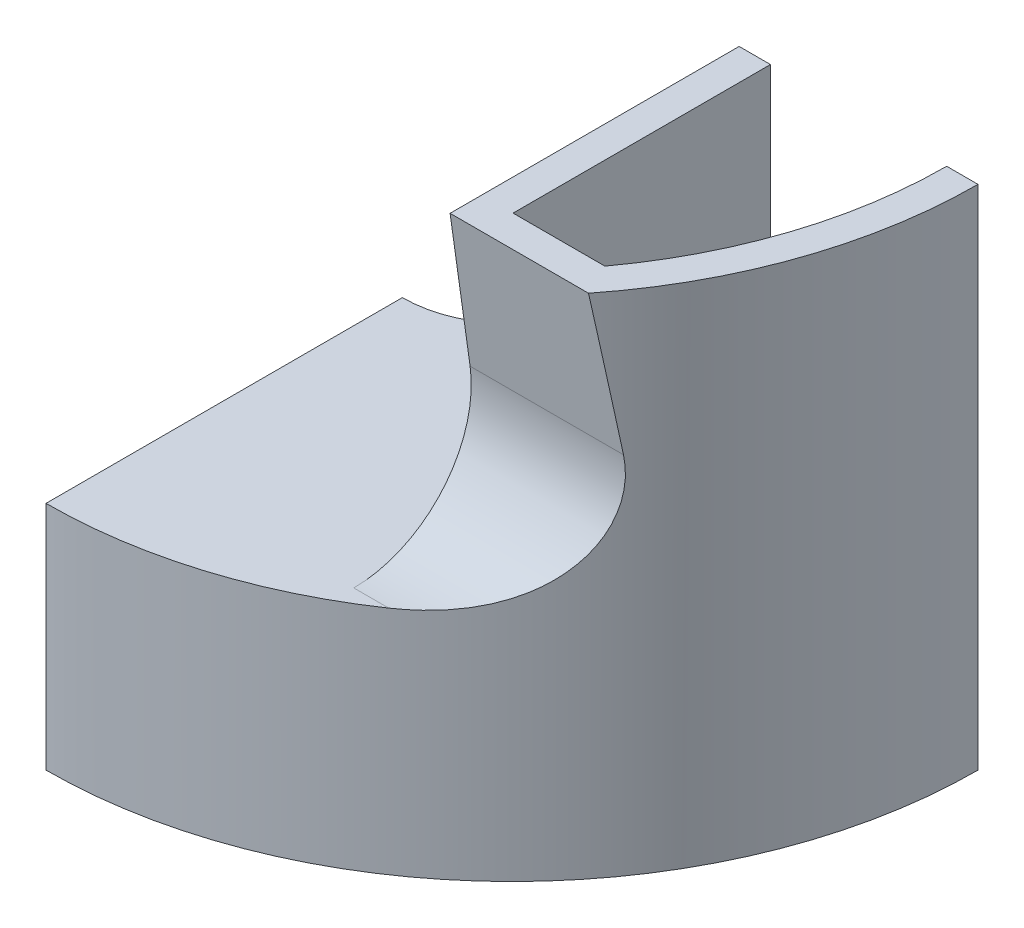
ISO-10303-21;
HEADER;
FILE_DESCRIPTION(('STEP AP214'),'2;1');
FILE_NAME('part.step','',(''),(''),'','','');
FILE_SCHEMA(('AUTOMOTIVE_DESIGN { 1 0 10303 214 1 1 1 1 }'));
ENDSEC;
DATA;
#1=APPLICATION_CONTEXT('core data for automotive mechanical design processes');
#2=APPLICATION_PROTOCOL_DEFINITION('international standard','automotive_design',2000,#1);
#3=PRODUCT_CONTEXT('',#1,'mechanical');
#4=PRODUCT('Part','Part','',(#3));
#5=PRODUCT_RELATED_PRODUCT_CATEGORY('part','',(#4));
#6=PRODUCT_DEFINITION_FORMATION('','',#4);
#7=PRODUCT_DEFINITION_CONTEXT('part definition',#1,'design');
#8=PRODUCT_DEFINITION('design','',#6,#7);
#9=PRODUCT_DEFINITION_SHAPE('','',#8);
#10=(LENGTH_UNIT() NAMED_UNIT(*) SI_UNIT(.MILLI.,.METRE.));
#11=(NAMED_UNIT(*) PLANE_ANGLE_UNIT() SI_UNIT($,.RADIAN.));
#12=(NAMED_UNIT(*) SI_UNIT($,.STERADIAN.) SOLID_ANGLE_UNIT());
#13=UNCERTAINTY_MEASURE_WITH_UNIT(LENGTH_MEASURE(1.E-05),#10,'distance_accuracy_value','');
#14=(GEOMETRIC_REPRESENTATION_CONTEXT(3) GLOBAL_UNCERTAINTY_ASSIGNED_CONTEXT((#13)) GLOBAL_UNIT_ASSIGNED_CONTEXT((#10,
#11,#12)) REPRESENTATION_CONTEXT('',''));
#15=CARTESIAN_POINT('',(0.,0.,0.));
#16=DIRECTION('',(0.,0.,1.));
#17=DIRECTION('',(1.,0.,0.));
#18=AXIS2_PLACEMENT_3D('',#15,#16,#17);
#19=CARTESIAN_POINT('',(0.,129.55,0.));
#20=DIRECTION('',(0.,-1.,0.));
#21=DIRECTION('',(0.,0.,-1.));
#22=AXIS2_PLACEMENT_3D('',#19,#20,#21);
#23=PLANE('',#22);
#24=DIRECTION('',(0.,0.,-1.));
#25=VECTOR('',#24,1.);
#26=CARTESIAN_POINT('',(66.,129.55,0.));
#27=LINE('',#26,#25);
#28=CARTESIAN_POINT('',(66.,129.55,65.7296962395799));
#29=VERTEX_POINT('',#28);
#30=CARTESIAN_POINT('',(66.,129.55,0.));
#31=VERTEX_POINT('',#30);
#32=EDGE_CURVE('E45',#29,#31,#27,.T.);
#33=ORIENTED_EDGE('',*,*,#32,.T.);
#34=DIRECTION('',(1.,0.,0.));
#35=VECTOR('',#34,1.);
#36=CARTESIAN_POINT('',(0.,129.55,0.));
#37=LINE('',#36,#35);
#38=CARTESIAN_POINT('',(58.,129.55,0.));
#39=VERTEX_POINT('',#38);
#40=EDGE_CURVE('E299',#39,#31,#37,.T.);
#41=ORIENTED_EDGE('',*,*,#40,.F.);
#42=DIRECTION('',(0.,0.,-1.));
#43=VECTOR('',#42,1.);
#44=CARTESIAN_POINT('',(58.,129.55,0.));
#45=LINE('',#44,#43);
#46=CARTESIAN_POINT('',(58.,129.55,73.8083168197288));
#47=VERTEX_POINT('',#46);
#48=EDGE_CURVE('E294',#47,#39,#45,.T.);
#49=ORIENTED_EDGE('',*,*,#48,.F.);
#50=DIRECTION('',(-1.,0.,0.));
#51=VECTOR('',#50,1.);
#52=CARTESIAN_POINT('',(119.001,129.55,73.8083168197288));
#53=LINE('',#52,#51);
#54=CARTESIAN_POINT('',(93.3452321666111,129.55,73.8083168197288));
#55=VERTEX_POINT('',#54);
#56=EDGE_CURVE('E296',#55,#47,#53,.T.);
#57=ORIENTED_EDGE('',*,*,#56,.F.);
#58=CARTESIAN_POINT('',(0.,129.55,0.));
#59=DIRECTION('',(0.,-1.,0.));
#60=DIRECTION('',(0.,0.,-1.));
#61=AXIS2_PLACEMENT_3D('',#58,#59,#60);
#62=CIRCLE('',#61,119.);
#63=CARTESIAN_POINT('',(119.,129.55,0.));
#64=VERTEX_POINT('',#63);
#65=EDGE_CURVE('E292',#64,#55,#62,.T.);
#66=ORIENTED_EDGE('',*,*,#65,.F.);
#67=CARTESIAN_POINT('',(111.,129.55,0.));
#68=VERTEX_POINT('',#67);
#69=EDGE_CURVE('E298',#68,#64,#37,.T.);
#70=ORIENTED_EDGE('',*,*,#69,.F.);
#71=CARTESIAN_POINT('',(0.,129.55,0.));
#72=DIRECTION('',(0.,-1.,0.));
#73=DIRECTION('',(0.,0.,-1.));
#74=AXIS2_PLACEMENT_3D('',#71,#72,#73);
#75=CIRCLE('',#74,111.);
#76=CARTESIAN_POINT('',(89.4461124490749,129.55,65.7296962395799));
#77=VERTEX_POINT('',#76);
#78=EDGE_CURVE('E301',#68,#77,#75,.T.);
#79=ORIENTED_EDGE('',*,*,#78,.T.);
#80=DIRECTION('',(-1.,0.,0.));
#81=VECTOR('',#80,1.);
#82=CARTESIAN_POINT('',(119.001,129.55,65.7296962395799));
#83=LINE('',#82,#81);
#84=EDGE_CURVE('E11',#77,#29,#83,.T.);
#85=ORIENTED_EDGE('',*,*,#84,.T.);
#86=EDGE_LOOP('',(#33,#41,#49,#57,#66,#70,#79,#85));
#87=FACE_BOUND('',#86,.T.);
#88=ADVANCED_FACE('F42',(#87),#23,.F.);
#89=CARTESIAN_POINT('',(15.5563491861041,12.9,15.556349186104));
#90=DIRECTION('',(0.,1.,0.));
#91=DIRECTION('',(0.,0.,-1.));
#92=AXIS2_PLACEMENT_3D('',#89,#90,#91);
#93=PLANE('',#92);
#94=CARTESIAN_POINT('',(15.5563491861041,12.9,15.556349186104));
#95=DIRECTION('',(0.,1.,0.));
#96=DIRECTION('',(0.,0.,-1.));
#97=AXIS2_PLACEMENT_3D('',#94,#95,#96);
#98=CIRCLE('',#97,2.1);
#99=CARTESIAN_POINT('',(15.5563491861041,12.9,13.456349186104));
#100=VERTEX_POINT('',#99);
#101=EDGE_CURVE('E341',#100,#100,#98,.T.);
#102=ORIENTED_EDGE('',*,*,#101,.T.);
#103=EDGE_LOOP('',(#102));
#104=FACE_BOUND('',#103,.T.);
#105=ADVANCED_FACE('F442',(#104),#93,.T.);
#106=CARTESIAN_POINT('',(15.5563491861041,12.9,15.556349186104));
#107=DIRECTION('',(0.,1.,0.));
#108=DIRECTION('',(0.,0.,1.));
#109=AXIS2_PLACEMENT_3D('',#106,#107,#108);
#110=CYLINDRICAL_SURFACE('',#109,2.1);
#111=ORIENTED_EDGE('',*,*,#101,.F.);
#112=EDGE_LOOP('',(#111));
#113=FACE_BOUND('',#112,.T.);
#114=CARTESIAN_POINT('',(15.5563491861041,22.9,15.556349186104));
#115=DIRECTION('',(0.,1.,0.));
#116=DIRECTION('',(0.,0.,-1.));
#117=AXIS2_PLACEMENT_3D('',#114,#115,#116);
#118=CIRCLE('',#117,2.1);
#119=CARTESIAN_POINT('',(15.5563491861041,22.9,13.456349186104));
#120=VERTEX_POINT('',#119);
#121=EDGE_CURVE('E289',#120,#120,#118,.T.);
#122=ORIENTED_EDGE('',*,*,#121,.T.);
#123=EDGE_LOOP('',(#122));
#124=FACE_BOUND('',#123,.T.);
#125=ADVANCED_FACE('F444',(#113,#124),#110,.F.);
#126=CARTESIAN_POINT('',(0.,22.9,0.));
#127=DIRECTION('',(0.,1.,0.));
#128=DIRECTION('',(0.,0.,1.));
#129=AXIS2_PLACEMENT_3D('',#126,#127,#128);
#130=CYLINDRICAL_SURFACE('',#129,28.);
#131=CARTESIAN_POINT('',(0.,22.9,0.));
#132=DIRECTION('',(0.,1.,0.));
#133=DIRECTION('',(0.,0.,1.));
#134=AXIS2_PLACEMENT_3D('',#131,#132,#133);
#135=CIRCLE('',#134,28.);
#136=CARTESIAN_POINT('',(0.,22.9,28.));
#137=VERTEX_POINT('',#136);
#138=CARTESIAN_POINT('',(28.,22.9,0.));
#139=VERTEX_POINT('',#138);
#140=EDGE_CURVE('E335',#137,#139,#135,.T.);
#141=ORIENTED_EDGE('',*,*,#140,.F.);
#142=DIRECTION('',(0.,1.,0.));
#143=VECTOR('',#142,1.);
#144=CARTESIAN_POINT('',(0.,22.9,28.));
#145=LINE('',#144,#143);
#146=CARTESIAN_POINT('',(0.,59.,28.));
#147=VERTEX_POINT('',#146);
#148=EDGE_CURVE('E273',#137,#147,#145,.T.);
#149=ORIENTED_EDGE('',*,*,#148,.T.);
#150=CARTESIAN_POINT('',(0.,59.,0.));
#151=DIRECTION('',(0.,1.,0.));
#152=DIRECTION('',(0.,0.,1.));
#153=AXIS2_PLACEMENT_3D('',#150,#151,#152);
#154=CIRCLE('',#153,28.);
#155=CARTESIAN_POINT('',(28.,59.,0.));
#156=VERTEX_POINT('',#155);
#157=EDGE_CURVE('E338',#147,#156,#154,.T.);
#158=ORIENTED_EDGE('',*,*,#157,.T.);
#159=DIRECTION('',(0.,1.,0.));
#160=VECTOR('',#159,1.);
#161=CARTESIAN_POINT('',(28.,22.9,0.));
#162=LINE('',#161,#160);
#163=EDGE_CURVE('E274',#156,#139,#162,.F.);
#164=ORIENTED_EDGE('',*,*,#163,.T.);
#165=EDGE_LOOP('',(#141,#149,#158,#164));
#166=FACE_BOUND('',#165,.T.);
#167=ADVANCED_FACE('F391',(#166),#130,.F.);
#168=CARTESIAN_POINT('',(0.,22.9,0.));
#169=DIRECTION('',(0.,1.,0.));
#170=DIRECTION('',(0.,0.,1.));
#171=AXIS2_PLACEMENT_3D('',#168,#169,#170);
#172=PLANE('',#171);
#173=DIRECTION('',(0.,0.,-1.));
#174=VECTOR('',#173,1.);
#175=CARTESIAN_POINT('',(0.,22.9,0.));
#176=LINE('',#175,#174);
#177=CARTESIAN_POINT('',(0.,22.9,12.5));
#178=VERTEX_POINT('',#177);
#179=EDGE_CURVE('E260',#137,#178,#176,.T.);
#180=ORIENTED_EDGE('',*,*,#179,.F.);
#181=ORIENTED_EDGE('',*,*,#140,.T.);
#182=DIRECTION('',(1.,0.,0.));
#183=VECTOR('',#182,1.);
#184=CARTESIAN_POINT('',(0.,22.9,0.));
#185=LINE('',#184,#183);
#186=CARTESIAN_POINT('',(12.5,22.9,0.));
#187=VERTEX_POINT('',#186);
#188=EDGE_CURVE('E257',#187,#139,#185,.T.);
#189=ORIENTED_EDGE('',*,*,#188,.F.);
#190=CARTESIAN_POINT('',(0.,22.9,0.));
#191=DIRECTION('',(0.,1.,0.));
#192=DIRECTION('',(0.,0.,1.));
#193=AXIS2_PLACEMENT_3D('',#190,#191,#192);
#194=CIRCLE('',#193,12.5);
#195=EDGE_CURVE('E332',#187,#178,#194,.F.);
#196=ORIENTED_EDGE('',*,*,#195,.T.);
#197=EDGE_LOOP('',(#180,#181,#189,#196));
#198=FACE_BOUND('',#197,.T.);
#199=ORIENTED_EDGE('',*,*,#121,.F.);
#200=EDGE_LOOP('',(#199));
#201=FACE_BOUND('',#200,.T.);
#202=ADVANCED_FACE('F452',(#198,#201),#172,.T.);
#203=CARTESIAN_POINT('',(0.,259.1,0.));
#204=DIRECTION('',(0.,-1.,0.));
#205=DIRECTION('',(0.,0.,-1.));
#206=AXIS2_PLACEMENT_3D('',#203,#204,#205);
#207=CYLINDRICAL_SURFACE('',#206,12.5);
#208=CARTESIAN_POINT('',(0.,7.00000000000001,0.));
#209=DIRECTION('',(0.,-1.,0.));
#210=DIRECTION('',(0.,0.,-1.));
#211=AXIS2_PLACEMENT_3D('',#208,#209,#210);
#212=CIRCLE('',#211,12.5);
#213=CARTESIAN_POINT('',(0.,7.00000000000001,12.5));
#214=VERTEX_POINT('',#213);
#215=CARTESIAN_POINT('',(12.5,7.00000000000001,0.));
#216=VERTEX_POINT('',#215);
#217=EDGE_CURVE('E287',#214,#216,#212,.F.);
#218=ORIENTED_EDGE('',*,*,#217,.F.);
#219=DIRECTION('',(0.,-1.,0.));
#220=VECTOR('',#219,1.);
#221=CARTESIAN_POINT('',(0.,259.1,12.5));
#222=LINE('',#221,#220);
#223=EDGE_CURVE('E268',#214,#178,#222,.F.);
#224=ORIENTED_EDGE('',*,*,#223,.T.);
#225=ORIENTED_EDGE('',*,*,#195,.F.);
#226=DIRECTION('',(0.,-1.,0.));
#227=VECTOR('',#226,1.);
#228=CARTESIAN_POINT('',(12.5,259.1,0.));
#229=LINE('',#228,#227);
#230=EDGE_CURVE('E269',#187,#216,#229,.T.);
#231=ORIENTED_EDGE('',*,*,#230,.T.);
#232=EDGE_LOOP('',(#218,#224,#225,#231));
#233=FACE_BOUND('',#232,.T.);
#234=ADVANCED_FACE('F564',(#233),#207,.F.);
#235=CARTESIAN_POINT('',(0.,7.,0.));
#236=DIRECTION('',(0.,-1.,0.));
#237=DIRECTION('',(0.,0.,-1.));
#238=AXIS2_PLACEMENT_3D('',#235,#236,#237);
#239=PLANE('',#238);
#240=DIRECTION('',(0.,0.,1.));
#241=VECTOR('',#240,1.);
#242=CARTESIAN_POINT('',(0.,7.,0.));
#243=LINE('',#242,#241);
#244=CARTESIAN_POINT('',(0.,7.,65.));
#245=VERTEX_POINT('',#244);
#246=EDGE_CURVE('E256',#214,#245,#243,.T.);
#247=ORIENTED_EDGE('',*,*,#246,.F.);
#248=ORIENTED_EDGE('',*,*,#217,.T.);
#249=DIRECTION('',(-1.,0.,0.));
#250=VECTOR('',#249,1.);
#251=CARTESIAN_POINT('',(0.,7.,0.));
#252=LINE('',#251,#250);
#253=CARTESIAN_POINT('',(65.,7.,0.));
#254=VERTEX_POINT('',#253);
#255=EDGE_CURVE('E253',#254,#216,#252,.T.);
#256=ORIENTED_EDGE('',*,*,#255,.F.);
#257=CARTESIAN_POINT('',(0.,7.,0.));
#258=DIRECTION('',(0.,-1.,0.));
#259=DIRECTION('',(0.,0.,-1.));
#260=AXIS2_PLACEMENT_3D('',#257,#258,#259);
#261=CIRCLE('',#260,65.);
#262=EDGE_CURVE('E290',#254,#245,#261,.T.);
#263=ORIENTED_EDGE('',*,*,#262,.T.);
#264=EDGE_LOOP('',(#247,#248,#256,#263));
#265=FACE_BOUND('',#264,.T.);
#266=ADVANCED_FACE('F575',(#265),#239,.T.);
#267=CARTESIAN_POINT('',(0.,7.,0.));
#268=DIRECTION('',(0.,-1.,0.));
#269=DIRECTION('',(0.,0.,-1.));
#270=AXIS2_PLACEMENT_3D('',#267,#268,#269);
#271=CYLINDRICAL_SURFACE('',#270,65.);
#272=CARTESIAN_POINT('',(0.,0.,0.));
#273=DIRECTION('',(0.,-1.,0.));
#274=DIRECTION('',(0.,0.,-1.));
#275=AXIS2_PLACEMENT_3D('',#272,#273,#274);
#276=CIRCLE('',#275,65.);
#277=CARTESIAN_POINT('',(65.,0.,0.));
#278=VERTEX_POINT('',#277);
#279=CARTESIAN_POINT('',(0.,0.,65.));
#280=VERTEX_POINT('',#279);
#281=EDGE_CURVE('E218',#278,#280,#276,.T.);
#282=ORIENTED_EDGE('',*,*,#281,.T.);
#283=DIRECTION('',(0.,-1.,0.));
#284=VECTOR('',#283,1.);
#285=CARTESIAN_POINT('',(0.,7.,65.));
#286=LINE('',#285,#284);
#287=EDGE_CURVE('E276',#280,#245,#286,.F.);
#288=ORIENTED_EDGE('',*,*,#287,.T.);
#289=ORIENTED_EDGE('',*,*,#262,.F.);
#290=DIRECTION('',(0.,-1.,0.));
#291=VECTOR('',#290,1.);
#292=CARTESIAN_POINT('',(65.,7.,0.));
#293=LINE('',#292,#291);
#294=EDGE_CURVE('E277',#254,#278,#293,.T.);
#295=ORIENTED_EDGE('',*,*,#294,.T.);
#296=EDGE_LOOP('',(#282,#288,#289,#295));
#297=FACE_BOUND('',#296,.T.);
#298=ADVANCED_FACE('F346',(#297),#271,.F.);
#299=CARTESIAN_POINT('',(0.,7.,0.));
#300=DIRECTION('',(0.,-1.,0.));
#301=DIRECTION('',(0.,0.,-1.));
#302=AXIS2_PLACEMENT_3D('',#299,#300,#301);
#303=CYLINDRICAL_SURFACE('',#302,73.);
#304=DIRECTION('',(0.,-1.,0.));
#305=VECTOR('',#304,1.);
#306=CARTESIAN_POINT('',(0.,7.,73.));
#307=LINE('',#306,#305);
#308=CARTESIAN_POINT('',(0.,8.,73.));
#309=VERTEX_POINT('',#308);
#310=CARTESIAN_POINT('',(0.,15.,73.));
#311=VERTEX_POINT('',#310);
#312=EDGE_CURVE('E198',#309,#311,#307,.F.);
#313=ORIENTED_EDGE('',*,*,#312,.F.);
#314=CARTESIAN_POINT('',(0.,8.,0.));
#315=DIRECTION('',(0.,1.,0.));
#316=DIRECTION('',(0.,0.,1.));
#317=AXIS2_PLACEMENT_3D('',#314,#315,#316);
#318=CIRCLE('',#317,73.);
#319=CARTESIAN_POINT('',(73.,8.,0.));
#320=VERTEX_POINT('',#319);
#321=EDGE_CURVE('E195',#320,#309,#318,.F.);
#322=ORIENTED_EDGE('',*,*,#321,.F.);
#323=DIRECTION('',(0.,-1.,0.));
#324=VECTOR('',#323,1.);
#325=CARTESIAN_POINT('',(73.,7.,0.));
#326=LINE('',#325,#324);
#327=CARTESIAN_POINT('',(73.,15.,0.));
#328=VERTEX_POINT('',#327);
#329=EDGE_CURVE('E189',#328,#320,#326,.T.);
#330=ORIENTED_EDGE('',*,*,#329,.F.);
#331=CARTESIAN_POINT('',(0.,15.,0.));
#332=DIRECTION('',(0.,-1.,0.));
#333=DIRECTION('',(0.,0.,-1.));
#334=AXIS2_PLACEMENT_3D('',#331,#332,#333);
#335=CIRCLE('',#334,73.);
#336=EDGE_CURVE('E193',#328,#311,#335,.T.);
#337=ORIENTED_EDGE('',*,*,#336,.T.);
#338=EDGE_LOOP('',(#313,#322,#330,#337));
#339=FACE_BOUND('',#338,.T.);
#340=ADVANCED_FACE('F191',(#339),#303,.T.);
#341=CARTESIAN_POINT('',(0.,15.,0.));
#342=DIRECTION('',(0.,-1.,0.));
#343=DIRECTION('',(0.,0.,-1.));
#344=AXIS2_PLACEMENT_3D('',#341,#342,#343);
#345=PLANE('',#344);
#346=CARTESIAN_POINT('',(0.,15.,0.));
#347=DIRECTION('',(0.,-1.,0.));
#348=DIRECTION('',(0.,0.,-1.));
#349=AXIS2_PLACEMENT_3D('',#346,#347,#348);
#350=CIRCLE('',#349,36.);
#351=CARTESIAN_POINT('',(0.,15.,36.));
#352=VERTEX_POINT('',#351);
#353=CARTESIAN_POINT('',(36.,15.,0.));
#354=VERTEX_POINT('',#353);
#355=EDGE_CURVE('E215',#352,#354,#350,.F.);
#356=ORIENTED_EDGE('',*,*,#355,.F.);
#357=DIRECTION('',(0.,0.,1.));
#358=VECTOR('',#357,1.);
#359=CARTESIAN_POINT('',(0.,15.,0.));
#360=LINE('',#359,#358);
#361=EDGE_CURVE('E210',#352,#311,#360,.T.);
#362=ORIENTED_EDGE('',*,*,#361,.T.);
#363=ORIENTED_EDGE('',*,*,#336,.F.);
#364=DIRECTION('',(-1.,0.,0.));
#365=VECTOR('',#364,1.);
#366=CARTESIAN_POINT('',(0.,15.,0.));
#367=LINE('',#366,#365);
#368=EDGE_CURVE('E201',#328,#354,#367,.T.);
#369=ORIENTED_EDGE('',*,*,#368,.T.);
#370=EDGE_LOOP('',(#356,#362,#363,#369));
#371=FACE_BOUND('',#370,.T.);
#372=ADVANCED_FACE('F212',(#371),#345,.F.);
#373=CARTESIAN_POINT('',(0.,22.9,0.));
#374=DIRECTION('',(0.,1.,0.));
#375=DIRECTION('',(0.,0.,1.));
#376=AXIS2_PLACEMENT_3D('',#373,#374,#375);
#377=CYLINDRICAL_SURFACE('',#376,36.);
#378=DIRECTION('',(0.,1.,0.));
#379=VECTOR('',#378,1.);
#380=CARTESIAN_POINT('',(0.,22.9,36.));
#381=LINE('',#380,#379);
#382=CARTESIAN_POINT('',(0.,51.,36.));
#383=VERTEX_POINT('',#382);
#384=EDGE_CURVE('E239',#352,#383,#381,.T.);
#385=ORIENTED_EDGE('',*,*,#384,.F.);
#386=ORIENTED_EDGE('',*,*,#355,.T.);
#387=DIRECTION('',(0.,1.,0.));
#388=VECTOR('',#387,1.);
#389=CARTESIAN_POINT('',(36.,22.9,0.));
#390=LINE('',#389,#388);
#391=CARTESIAN_POINT('',(36.,51.,0.));
#392=VERTEX_POINT('',#391);
#393=EDGE_CURVE('E205',#392,#354,#390,.F.);
#394=ORIENTED_EDGE('',*,*,#393,.F.);
#395=CARTESIAN_POINT('',(0.,51.,0.));
#396=DIRECTION('',(0.,1.,0.));
#397=DIRECTION('',(0.,0.,1.));
#398=AXIS2_PLACEMENT_3D('',#395,#396,#397);
#399=CIRCLE('',#398,36.);
#400=EDGE_CURVE('E232',#383,#392,#399,.T.);
#401=ORIENTED_EDGE('',*,*,#400,.F.);
#402=EDGE_LOOP('',(#385,#386,#394,#401));
#403=FACE_BOUND('',#402,.T.);
#404=ADVANCED_FACE('F320',(#403),#377,.T.);
#405=CARTESIAN_POINT('',(0.,8.,0.));
#406=DIRECTION('',(0.,1.,0.));
#407=DIRECTION('',(0.,0.,1.));
#408=AXIS2_PLACEMENT_3D('',#405,#406,#407);
#409=PLANE('',#408);
#410=DIRECTION('',(0.,0.,-1.));
#411=VECTOR('',#410,1.);
#412=CARTESIAN_POINT('',(0.,8.,0.));
#413=LINE('',#412,#411);
#414=CARTESIAN_POINT('',(0.,8.,111.));
#415=VERTEX_POINT('',#414);
#416=EDGE_CURVE('E242',#415,#309,#413,.T.);
#417=ORIENTED_EDGE('',*,*,#416,.F.);
#418=CARTESIAN_POINT('',(0.,8.,0.));
#419=DIRECTION('',(0.,1.,0.));
#420=DIRECTION('',(0.,0.,1.));
#421=AXIS2_PLACEMENT_3D('',#418,#419,#420);
#422=CIRCLE('',#421,111.);
#423=CARTESIAN_POINT('',(111.,8.,0.));
#424=VERTEX_POINT('',#423);
#425=EDGE_CURVE('E228',#415,#424,#422,.T.);
#426=ORIENTED_EDGE('',*,*,#425,.T.);
#427=DIRECTION('',(1.,0.,0.));
#428=VECTOR('',#427,1.);
#429=CARTESIAN_POINT('',(0.,8.,0.));
#430=LINE('',#429,#428);
#431=EDGE_CURVE('E240',#320,#424,#430,.T.);
#432=ORIENTED_EDGE('',*,*,#431,.F.);
#433=ORIENTED_EDGE('',*,*,#321,.T.);
#434=EDGE_LOOP('',(#417,#426,#432,#433));
#435=FACE_BOUND('',#434,.T.);
#436=ADVANCED_FACE('F375',(#435),#409,.T.);
#437=CARTESIAN_POINT('',(0.,0.,0.));
#438=DIRECTION('',(0.,1.,0.));
#439=DIRECTION('',(0.,0.,1.));
#440=AXIS2_PLACEMENT_3D('',#437,#438,#439);
#441=PLANE('',#440);
#442=CARTESIAN_POINT('',(0.,0.,0.));
#443=DIRECTION('',(0.,1.,0.));
#444=DIRECTION('',(0.,0.,1.));
#445=AXIS2_PLACEMENT_3D('',#442,#443,#444);
#446=CIRCLE('',#445,119.);
#447=CARTESIAN_POINT('',(0.,0.,119.));
#448=VERTEX_POINT('',#447);
#449=CARTESIAN_POINT('',(119.,0.,0.));
#450=VERTEX_POINT('',#449);
#451=EDGE_CURVE('E214',#448,#450,#446,.T.);
#452=ORIENTED_EDGE('',*,*,#451,.F.);
#453=DIRECTION('',(0.,0.,-1.));
#454=VECTOR('',#453,1.);
#455=CARTESIAN_POINT('',(0.,0.,0.));
#456=LINE('',#455,#454);
#457=EDGE_CURVE('E264',#448,#280,#456,.T.);
#458=ORIENTED_EDGE('',*,*,#457,.T.);
#459=ORIENTED_EDGE('',*,*,#281,.F.);
#460=DIRECTION('',(1.,0.,0.));
#461=VECTOR('',#460,1.);
#462=CARTESIAN_POINT('',(0.,0.,0.));
#463=LINE('',#462,#461);
#464=EDGE_CURVE('E266',#278,#450,#463,.T.);
#465=ORIENTED_EDGE('',*,*,#464,.T.);
#466=EDGE_LOOP('',(#452,#458,#459,#465));
#467=FACE_BOUND('',#466,.T.);
#468=ADVANCED_FACE('F354',(#467),#441,.F.);
#469=CARTESIAN_POINT('',(0.,0.,0.));
#470=DIRECTION('',(1.,0.,0.));
#471=DIRECTION('',(0.,0.,-1.));
#472=AXIS2_PLACEMENT_3D('',#469,#470,#471);
#473=PLANE('',#472);
#474=ORIENTED_EDGE('',*,*,#384,.T.);
#475=DIRECTION('',(0.,0.,-1.));
#476=VECTOR('',#475,1.);
#477=CARTESIAN_POINT('',(0.,51.,0.));
#478=LINE('',#477,#476);
#479=CARTESIAN_POINT('',(0.,51.,111.));
#480=VERTEX_POINT('',#479);
#481=EDGE_CURVE('E209',#480,#383,#478,.T.);
#482=ORIENTED_EDGE('',*,*,#481,.F.);
#483=DIRECTION('',(0.,-1.,0.));
#484=VECTOR('',#483,1.);
#485=CARTESIAN_POINT('',(0.,59.,111.));
#486=LINE('',#485,#484);
#487=EDGE_CURVE('E248',#480,#415,#486,.T.);
#488=ORIENTED_EDGE('',*,*,#487,.T.);
#489=ORIENTED_EDGE('',*,*,#416,.T.);
#490=ORIENTED_EDGE('',*,*,#312,.T.);
#491=ORIENTED_EDGE('',*,*,#361,.F.);
#492=EDGE_LOOP('',(#474,#482,#488,#489,#490,#491));
#493=FACE_BOUND('',#492,.T.);
#494=ORIENTED_EDGE('',*,*,#457,.F.);
#495=DIRECTION('',(0.,-1.,0.));
#496=VECTOR('',#495,1.);
#497=CARTESIAN_POINT('',(0.,59.,119.));
#498=LINE('',#497,#496);
#499=CARTESIAN_POINT('',(0.,59.,119.));
#500=VERTEX_POINT('',#499);
#501=EDGE_CURVE('E265',#500,#448,#498,.T.);
#502=ORIENTED_EDGE('',*,*,#501,.F.);
#503=DIRECTION('',(0.,0.,-1.));
#504=VECTOR('',#503,1.);
#505=CARTESIAN_POINT('',(0.,59.,0.));
#506=LINE('',#505,#504);
#507=EDGE_CURVE('E252',#500,#147,#506,.T.);
#508=ORIENTED_EDGE('',*,*,#507,.T.);
#509=ORIENTED_EDGE('',*,*,#148,.F.);
#510=ORIENTED_EDGE('',*,*,#179,.T.);
#511=ORIENTED_EDGE('',*,*,#223,.F.);
#512=ORIENTED_EDGE('',*,*,#246,.T.);
#513=ORIENTED_EDGE('',*,*,#287,.F.);
#514=EDGE_LOOP('',(#494,#502,#508,#509,#510,#511,#512,#513));
#515=FACE_BOUND('',#514,.T.);
#516=ADVANCED_FACE('F371',(#493,#515),#473,.F.);
#517=CARTESIAN_POINT('',(0.,59.,0.));
#518=DIRECTION('',(0.,1.,0.));
#519=DIRECTION('',(0.,0.,1.));
#520=AXIS2_PLACEMENT_3D('',#517,#518,#519);
#521=PLANE('',#520);
#522=ORIENTED_EDGE('',*,*,#507,.F.);
#523=CARTESIAN_POINT('',(0.,59.,0.));
#524=DIRECTION('',(0.,1.,0.));
#525=DIRECTION('',(0.,0.,1.));
#526=AXIS2_PLACEMENT_3D('',#523,#524,#525);
#527=CIRCLE('',#526,119.);
#528=CARTESIAN_POINT('',(66.9149522506159,59.,98.4042131481055));
#529=VERTEX_POINT('',#528);
#530=EDGE_CURVE('E283',#500,#529,#527,.T.);
#531=ORIENTED_EDGE('',*,*,#530,.T.);
#532=DIRECTION('',(-1.,0.,0.));
#533=VECTOR('',#532,1.);
#534=CARTESIAN_POINT('',(0.,59.,98.4042131481055));
#535=LINE('',#534,#533);
#536=CARTESIAN_POINT('',(58.,59.,98.4042131481055));
#537=VERTEX_POINT('',#536);
#538=EDGE_CURVE('E285',#529,#537,#535,.T.);
#539=ORIENTED_EDGE('',*,*,#538,.T.);
#540=DIRECTION('',(0.,0.,-1.));
#541=VECTOR('',#540,1.);
#542=CARTESIAN_POINT('',(58.,59.,63.8931609314753));
#543=LINE('',#542,#541);
#544=CARTESIAN_POINT('',(58.,59.,0.));
#545=VERTEX_POINT('',#544);
#546=EDGE_CURVE('E328',#537,#545,#543,.T.);
#547=ORIENTED_EDGE('',*,*,#546,.T.);
#548=DIRECTION('',(1.,0.,0.));
#549=VECTOR('',#548,1.);
#550=CARTESIAN_POINT('',(0.,59.,0.));
#551=LINE('',#550,#549);
#552=EDGE_CURVE('E249',#156,#545,#551,.T.);
#553=ORIENTED_EDGE('',*,*,#552,.F.);
#554=ORIENTED_EDGE('',*,*,#157,.F.);
#555=EDGE_LOOP('',(#522,#531,#539,#547,#553,#554));
#556=FACE_BOUND('',#555,.T.);
#557=ADVANCED_FACE('F389',(#556),#521,.T.);
#558=CARTESIAN_POINT('',(0.,89.,98.4042131481055));
#559=DIRECTION('',(-1.,0.,0.));
#560=DIRECTION('',(0.,0.,1.));
#561=AXIS2_PLACEMENT_3D('',#558,#559,#560);
#562=CYLINDRICAL_SURFACE('',#561,30.);
#563=CARTESIAN_POINT('',(97.1691107201382,93.1751930288019,68.6961710858584));
#564=CARTESIAN_POINT('',(97.2035026625549,92.8290518007664,68.6475208213906));
#565=CARTESIAN_POINT('',(97.2336008317673,92.4816792183602,68.6048743173237));
#566=CARTESIAN_POINT('',(97.2851809634687,91.785027268412,68.5317128099037));
#567=CARTESIAN_POINT('',(97.3066630443198,91.4357479271305,68.5011976398987));
#568=CARTESIAN_POINT('',(97.3581329387751,90.3860827672068,68.4280482117891));
#569=CARTESIAN_POINT('',(97.3751654151396,89.6836580045681,68.4037802122022));
#570=CARTESIAN_POINT('',(97.3745498392752,88.2806195516063,68.4046566923155));
#571=CARTESIAN_POINT('',(97.3569887004025,87.5800057394768,68.4296773387143));
#572=CARTESIAN_POINT('',(97.3048612064807,86.5331698948514,68.5037570212205));
#573=CARTESIAN_POINT('',(97.2831862674266,86.1848906345548,68.5345437968697));
#574=CARTESIAN_POINT('',(97.2312633427347,85.4901664039751,68.608188029732));
#575=CARTESIAN_POINT('',(97.2010132736317,85.1437219003398,68.6510484204074));
#576=CARTESIAN_POINT('',(97.0974456103909,84.1081262627002,68.7975337550674));
#577=CARTESIAN_POINT('',(97.0113085726026,83.4226730697264,68.9190657072755));
#578=CARTESIAN_POINT('',(96.8052854430863,82.0667076789843,69.2081505983968));
#579=CARTESIAN_POINT('',(96.6853981024923,81.3961960350905,69.3757052402869));
#580=CARTESIAN_POINT('',(96.4807485419556,80.4050438806365,69.6597349282022));
#581=CARTESIAN_POINT('',(96.4083804408067,80.0770383887426,69.7598819380832));
#582=CARTESIAN_POINT('',(96.2554778425896,79.4264599151187,69.9707078100231));
#583=CARTESIAN_POINT('',(96.1749454974569,79.1038855278599,70.0813838963514));
#584=CARTESIAN_POINT('',(95.9212029057725,78.144857563692,70.428724013927));
#585=CARTESIAN_POINT('',(95.7358372575596,77.5170514914235,70.680713633008));
#586=CARTESIAN_POINT('',(95.3303011990145,76.2778784902376,71.2267589142235));
#587=CARTESIAN_POINT('',(95.1095917826214,75.6669736510758,71.5214579268508));
#588=CARTESIAN_POINT('',(94.6368603372797,74.475939281655,72.1458101195891));
#589=CARTESIAN_POINT('',(94.3848381248191,73.8958099317876,72.4754635045526));
#590=CARTESIAN_POINT('',(93.8507126130484,72.7685652461654,73.1657993247504));
#591=CARTESIAN_POINT('',(93.5685992313256,72.2214610726562,73.5264921522574));
#592=CARTESIAN_POINT('',(92.9757955752651,71.1622162433448,74.2746877017772));
#593=CARTESIAN_POINT('',(92.6651039194953,70.6500772797967,74.6621917195793));
#594=CARTESIAN_POINT('',(91.9834916460802,69.6113506561909,75.5007161192071));
#595=CARTESIAN_POINT('',(91.6096610813085,69.0886445067698,75.954178895452));
#596=CARTESIAN_POINT('',(90.8312757047662,68.0878505594177,76.8833315024651));
#597=CARTESIAN_POINT('',(90.4267195913937,67.6097646536129,77.3590222745314));
#598=CARTESIAN_POINT('',(89.5891360353599,66.6982610860838,78.3274951988207));
#599=CARTESIAN_POINT('',(89.1561133464078,66.264835997211,78.8202744909249));
#600=CARTESIAN_POINT('',(88.263581300696,65.4417999125676,79.8184721989468));
#601=CARTESIAN_POINT('',(87.8040662925835,65.0521983179416,80.3238932985044));
#602=CARTESIAN_POINT('',(86.9736830858528,64.4039167885354,81.2210411552375));
#603=CARTESIAN_POINT('',(86.6079218162753,64.1362202683538,81.6110262146877));
#604=CARTESIAN_POINT('',(85.8633086684226,63.6249287322978,82.394079361406));
#605=CARTESIAN_POINT('',(85.4844589736369,63.381329722279,82.7871469260554));
#606=CARTESIAN_POINT('',(84.3290835544625,62.6852639555573,83.9691501165847));
#607=CARTESIAN_POINT('',(83.5339271718402,62.2676797231553,84.7606741298762));
#608=CARTESIAN_POINT('',(81.8973828508802,61.5173048671928,86.3430420699189));
#609=CARTESIAN_POINT('',(81.05581539747,61.1848763350274,87.1338692944885));
#610=CARTESIAN_POINT('',(79.335111406668,60.5993677840922,88.7034151447867));
#611=CARTESIAN_POINT('',(78.4559811160262,60.3462746296539,89.4821357547106));
#612=CARTESIAN_POINT('',(76.7179926373262,59.9245167171291,90.9757338071823));
#613=CARTESIAN_POINT('',(75.8610179349688,59.7517391363695,91.6916607636214));
#614=CARTESIAN_POINT('',(74.1213598707769,59.4631971102794,93.1035944454814));
#615=CARTESIAN_POINT('',(73.2386727217442,59.3474411091156,93.7995982061662));
#616=CARTESIAN_POINT('',(71.4599694479966,59.1679410306458,95.1615170832342));
#617=CARTESIAN_POINT('',(70.5641885293657,59.1036668086482,95.8276703888316));
#618=CARTESIAN_POINT('',(69.2060660108202,59.0406946097836,96.8082238088964));
#619=CARTESIAN_POINT('',(68.7510724068631,59.0252767257605,97.1318789370165));
#620=CARTESIAN_POINT('',(67.8364442586494,59.0049316589748,97.7728421221446));
#621=CARTESIAN_POINT('',(67.3768100075817,59.0000038175831,98.0901505763963));
#622=CARTESIAN_POINT('',(66.9149522506159,59.,98.4042131481055));
#623=B_SPLINE_CURVE_WITH_KNOTS('',3,(#563,#564,#565,#566,#567,#568,#569,#570,#571,#572,#573,
#574,#575,#576,#577,#578,#579,#580,#581,#582,#583,#584,#585,#586,#587,#588,#589,#590,#591,#592,
#593,#594,#595,#596,#597,#598,#599,#600,#601,#602,#603,#604,#605,#606,#607,#608,#609,#610,#611,
#612,#613,#614,#615,#616,#617,#618,#619,#620,#621,#622),.UNSPECIFIED.,.F.,.F.,(4,2,2,2,2,2,2,2,
2,2,2,2,2,2,2,2,2,2,2,2,2,2,2,2,2,2,2,2,2,4),(0.,1.05353613670768,2.10705780015633,
4.21345850300713,6.31457381231898,7.36522123687664,8.41612415216738,10.5178101319472,
12.6195738908541,13.6708316742512,14.7218130834911,16.8236245706876,18.9612329228405,
21.0988538032771,23.2371931830204,25.3756359813389,27.7328398093873,30.0901435495366,
32.4470546323399,34.8044703662111,36.5976448739874,38.3905216646581,41.9772491372115,
45.578983671142,49.1801215455195,52.567962147544,55.9563042947251,59.3092887604277,
60.9848935954147,62.6603932225846),.UNSPECIFIED.);
#624=CARTESIAN_POINT('',(97.1691107201382,93.1751930288022,68.6961710858585));
#625=VERTEX_POINT('',#624);
#626=EDGE_CURVE('E295',#625,#529,#623,.T.);
#627=ORIENTED_EDGE('',*,*,#626,.F.);
#628=DIRECTION('',(-1.,0.,0.));
#629=VECTOR('',#628,1.);
#630=CARTESIAN_POINT('',(119.001,93.1751930288019,68.6961710858584));
#631=LINE('',#630,#629);
#632=CARTESIAN_POINT('',(58.,93.1751930288019,68.6961710858584));
#633=VERTEX_POINT('',#632);
#634=EDGE_CURVE('E705',#633,#625,#631,.F.);
#635=ORIENTED_EDGE('',*,*,#634,.F.);
#636=CARTESIAN_POINT('',(58.,89.,98.4042131481055));
#637=DIRECTION('',(1.,0.,0.));
#638=DIRECTION('',(0.,0.,-1.));
#639=AXIS2_PLACEMENT_3D('',#636,#637,#638);
#640=CIRCLE('',#639,30.);
#641=EDGE_CURVE('E403',#537,#633,#640,.T.);
#642=ORIENTED_EDGE('',*,*,#641,.F.);
#643=ORIENTED_EDGE('',*,*,#538,.F.);
#644=EDGE_LOOP('',(#627,#635,#642,#643));
#645=FACE_BOUND('',#644,.T.);
#646=ADVANCED_FACE('F408',(#645),#562,.F.);
#647=CARTESIAN_POINT('',(119.001,59.,63.8931609314753));
#648=DIRECTION('',(0.,0.139173100960062,-0.990268068741571));
#649=DIRECTION('',(0.,0.990268068741571,0.139173100960062));
#650=AXIS2_PLACEMENT_3D('',#647,#648,#649);
#651=PLANE('',#650);
#652=CARTESIAN_POINT('',(0.,-395.623462759252,0.));
#653=DIRECTION('',(0.,0.139173100960062,-0.990268068741571));
#654=DIRECTION('',(0.,-0.990268068741571,-0.139173100960062));
#655=AXIS2_PLACEMENT_3D('',#652,#653,#654);
#656=ELLIPSE('',#655,855.050287585018,119.);
#657=EDGE_CURVE('E286',#625,#55,#656,.F.);
#658=ORIENTED_EDGE('',*,*,#657,.T.);
#659=ORIENTED_EDGE('',*,*,#56,.T.);
#660=DIRECTION('',(0.,-0.990268068741571,-0.139173100960062));
#661=VECTOR('',#660,1.);
#662=CARTESIAN_POINT('',(58.,59.,63.8931609314753));
#663=LINE('',#662,#661);
#664=EDGE_CURVE('E331',#47,#633,#663,.T.);
#665=ORIENTED_EDGE('',*,*,#664,.T.);
#666=ORIENTED_EDGE('',*,*,#634,.T.);
#667=EDGE_LOOP('',(#658,#659,#665,#666));
#668=FACE_BOUND('',#667,.T.);
#669=ADVANCED_FACE('F413',(#668),#651,.F.);
#670=CARTESIAN_POINT('',(0.,0.,0.));
#671=DIRECTION('',(0.,0.,1.));
#672=DIRECTION('',(1.,0.,0.));
#673=AXIS2_PLACEMENT_3D('',#670,#671,#672);
#674=PLANE('',#673);
#675=DIRECTION('',(0.,-1.,0.));
#676=VECTOR('',#675,1.);
#677=CARTESIAN_POINT('',(58.,179.1,0.));
#678=LINE('',#677,#676);
#679=EDGE_CURVE('E271',#39,#545,#678,.T.);
#680=ORIENTED_EDGE('',*,*,#679,.F.);
#681=ORIENTED_EDGE('',*,*,#40,.T.);
#682=DIRECTION('',(0.,-1.,0.));
#683=VECTOR('',#682,1.);
#684=CARTESIAN_POINT('',(66.,179.1,0.));
#685=LINE('',#684,#683);
#686=CARTESIAN_POINT('',(66.,51.,0.));
#687=VERTEX_POINT('',#686);
#688=EDGE_CURVE('E243',#31,#687,#685,.T.);
#689=ORIENTED_EDGE('',*,*,#688,.T.);
#690=DIRECTION('',(1.,0.,0.));
#691=VECTOR('',#690,1.);
#692=CARTESIAN_POINT('',(0.,51.,0.));
#693=LINE('',#692,#691);
#694=EDGE_CURVE('E279',#392,#687,#693,.T.);
#695=ORIENTED_EDGE('',*,*,#694,.F.);
#696=ORIENTED_EDGE('',*,*,#393,.T.);
#697=ORIENTED_EDGE('',*,*,#368,.F.);
#698=ORIENTED_EDGE('',*,*,#329,.T.);
#699=ORIENTED_EDGE('',*,*,#431,.T.);
#700=DIRECTION('',(0.,-1.,0.));
#701=VECTOR('',#700,1.);
#702=CARTESIAN_POINT('',(111.,59.,0.));
#703=LINE('',#702,#701);
#704=EDGE_CURVE('E245',#424,#68,#703,.F.);
#705=ORIENTED_EDGE('',*,*,#704,.T.);
#706=ORIENTED_EDGE('',*,*,#69,.T.);
#707=DIRECTION('',(0.,-1.,0.));
#708=VECTOR('',#707,1.);
#709=CARTESIAN_POINT('',(119.,59.,0.));
#710=LINE('',#709,#708);
#711=EDGE_CURVE('E261',#450,#64,#710,.F.);
#712=ORIENTED_EDGE('',*,*,#711,.F.);
#713=ORIENTED_EDGE('',*,*,#464,.F.);
#714=ORIENTED_EDGE('',*,*,#294,.F.);
#715=ORIENTED_EDGE('',*,*,#255,.T.);
#716=ORIENTED_EDGE('',*,*,#230,.F.);
#717=ORIENTED_EDGE('',*,*,#188,.T.);
#718=ORIENTED_EDGE('',*,*,#163,.F.);
#719=ORIENTED_EDGE('',*,*,#552,.T.);
#720=EDGE_LOOP('',(#680,#681,#689,#695,#696,#697,#698,#699,#705,#706,#712,#713,#714,#715,#716,
#717,#718,#719));
#721=FACE_BOUND('',#720,.T.);
#722=ADVANCED_FACE('F203',(#721),#674,.F.);
#723=CARTESIAN_POINT('',(0.,59.,0.));
#724=DIRECTION('',(0.,-1.,0.));
#725=DIRECTION('',(0.,0.,-1.));
#726=AXIS2_PLACEMENT_3D('',#723,#724,#725);
#727=CYLINDRICAL_SURFACE('',#726,119.);
#728=ORIENTED_EDGE('',*,*,#711,.T.);
#729=ORIENTED_EDGE('',*,*,#65,.T.);
#730=ORIENTED_EDGE('',*,*,#657,.F.);
#731=ORIENTED_EDGE('',*,*,#626,.T.);
#732=ORIENTED_EDGE('',*,*,#530,.F.);
#733=ORIENTED_EDGE('',*,*,#501,.T.);
#734=ORIENTED_EDGE('',*,*,#451,.T.);
#735=EDGE_LOOP('',(#728,#729,#730,#731,#732,#733,#734));
#736=FACE_BOUND('',#735,.T.);
#737=ADVANCED_FACE('F381',(#736),#727,.T.);
#738=CARTESIAN_POINT('',(58.,179.1,0.));
#739=DIRECTION('',(1.,0.,0.));
#740=DIRECTION('',(0.,0.,-1.));
#741=AXIS2_PLACEMENT_3D('',#738,#739,#740);
#742=PLANE('',#741);
#743=ORIENTED_EDGE('',*,*,#664,.F.);
#744=ORIENTED_EDGE('',*,*,#48,.T.);
#745=ORIENTED_EDGE('',*,*,#679,.T.);
#746=ORIENTED_EDGE('',*,*,#546,.F.);
#747=ORIENTED_EDGE('',*,*,#641,.T.);
#748=EDGE_LOOP('',(#743,#744,#745,#746,#747));
#749=FACE_BOUND('',#748,.T.);
#750=ADVANCED_FACE('F478',(#749),#742,.F.);
#751=CARTESIAN_POINT('',(0.,51.,0.));
#752=DIRECTION('',(0.,1.,0.));
#753=DIRECTION('',(0.,0.,1.));
#754=AXIS2_PLACEMENT_3D('',#751,#752,#753);
#755=PLANE('',#754);
#756=CARTESIAN_POINT('',(0.,51.,0.));
#757=DIRECTION('',(0.,1.,0.));
#758=DIRECTION('',(0.,0.,1.));
#759=AXIS2_PLACEMENT_3D('',#756,#757,#758);
#760=CIRCLE('',#759,111.);
#761=CARTESIAN_POINT('',(66.,51.,89.2468486838611));
#762=VERTEX_POINT('',#761);
#763=EDGE_CURVE('E220',#480,#762,#760,.T.);
#764=ORIENTED_EDGE('',*,*,#763,.F.);
#765=ORIENTED_EDGE('',*,*,#481,.T.);
#766=ORIENTED_EDGE('',*,*,#400,.T.);
#767=ORIENTED_EDGE('',*,*,#694,.T.);
#768=DIRECTION('',(0.,0.,-1.));
#769=VECTOR('',#768,1.);
#770=CARTESIAN_POINT('',(66.,51.,0.));
#771=LINE('',#770,#769);
#772=EDGE_CURVE('E224',#762,#687,#771,.T.);
#773=ORIENTED_EDGE('',*,*,#772,.F.);
#774=EDGE_LOOP('',(#764,#765,#766,#767,#773));
#775=FACE_BOUND('',#774,.T.);
#776=ADVANCED_FACE('F314',(#775),#755,.F.);
#777=CARTESIAN_POINT('',(66.,179.1,0.));
#778=DIRECTION('',(1.,0.,0.));
#779=DIRECTION('',(0.,0.,-1.));
#780=AXIS2_PLACEMENT_3D('',#777,#778,#779);
#781=PLANE('',#780);
#782=ORIENTED_EDGE('',*,*,#32,.F.);
#783=DIRECTION('',(0.,-0.990268068741571,-0.139173100960062));
#784=VECTOR('',#783,1.);
#785=CARTESIAN_POINT('',(66.,60.1133848076805,55.9710163815428));
#786=LINE('',#785,#784);
#787=CARTESIAN_POINT('',(66.,94.2885778364824,60.7740265359258));
#788=VERTEX_POINT('',#787);
#789=EDGE_CURVE('E236',#29,#788,#786,.T.);
#790=ORIENTED_EDGE('',*,*,#789,.T.);
#791=CARTESIAN_POINT('',(66.,89.,98.4042131481055));
#792=DIRECTION('',(1.,0.,0.));
#793=DIRECTION('',(0.,0.,-1.));
#794=AXIS2_PLACEMENT_3D('',#791,#792,#793);
#795=CIRCLE('',#794,38.);
#796=CARTESIAN_POINT('',(66.,52.1198877974999,89.2468486838611));
#797=VERTEX_POINT('',#796);
#798=EDGE_CURVE('E235',#797,#788,#795,.T.);
#799=ORIENTED_EDGE('',*,*,#798,.F.);
#800=DIRECTION('',(0.,-1.,0.));
#801=VECTOR('',#800,1.);
#802=CARTESIAN_POINT('',(66.,59.,89.2468486838611));
#803=LINE('',#802,#801);
#804=EDGE_CURVE('E231',#762,#797,#803,.F.);
#805=ORIENTED_EDGE('',*,*,#804,.F.);
#806=ORIENTED_EDGE('',*,*,#772,.T.);
#807=ORIENTED_EDGE('',*,*,#688,.F.);
#808=EDGE_LOOP('',(#782,#790,#799,#805,#806,#807));
#809=FACE_BOUND('',#808,.T.);
#810=ADVANCED_FACE('F309',(#809),#781,.T.);
#811=CARTESIAN_POINT('',(0.,89.,98.4042131481055));
#812=DIRECTION('',(-1.,0.,0.));
#813=DIRECTION('',(0.,0.,1.));
#814=AXIS2_PLACEMENT_3D('',#811,#812,#813);
#815=CYLINDRICAL_SURFACE('',#814,38.);
#816=ORIENTED_EDGE('',*,*,#798,.T.);
#817=DIRECTION('',(1.,0.,0.));
#818=VECTOR('',#817,1.);
#819=CARTESIAN_POINT('',(119.001,94.2885778364824,60.7740265359258));
#820=LINE('',#819,#818);
#821=CARTESIAN_POINT('',(92.8844319496576,94.2885778364824,60.7740265359258));
#822=VERTEX_POINT('',#821);
#823=EDGE_CURVE('E715',#788,#822,#820,.T.);
#824=ORIENTED_EDGE('',*,*,#823,.T.);
#825=CARTESIAN_POINT('',(92.8844319496576,94.2885778364824,60.7740265359258));
#826=CARTESIAN_POINT('',(92.9255140749339,93.8418177140992,60.7112291119299));
#827=CARTESIAN_POINT('',(92.961342800357,93.3934658503145,60.6563400093572));
#828=CARTESIAN_POINT('',(93.0224923037686,92.4943810242358,60.5625243640402));
#829=CARTESIAN_POINT('',(93.0478130597495,92.0436480569567,60.5235978547275));
#830=CARTESIAN_POINT('',(93.0879439270899,91.1406362793364,60.4618556962844));
#831=CARTESIAN_POINT('',(93.1027547597956,90.6883575772278,60.4390389414651));
#832=CARTESIAN_POINT('',(93.1218696248415,89.7830846392561,60.4095823696749));
#833=CARTESIAN_POINT('',(93.1261736891282,89.3300904055729,60.4029425035171));
#834=CARTESIAN_POINT('',(93.1233232010776,87.9729039453061,60.4073448755452));
#835=CARTESIAN_POINT('',(93.1004883531989,87.0686467885696,60.4425819683163));
#836=CARTESIAN_POINT('',(93.0129414222171,85.2671088416527,60.5772149979772));
#837=CARTESIAN_POINT('',(92.948230032905,84.3698279361422,60.6766098719307));
#838=CARTESIAN_POINT('',(92.7769101807485,82.5881421259001,60.9382423979053));
#839=CARTESIAN_POINT('',(92.6702853991932,81.7037423756176,61.1005045265353));
#840=CARTESIAN_POINT('',(92.4151871000396,79.9544113275924,61.4856605563875));
#841=CARTESIAN_POINT('',(92.266713131058,79.0894802399464,61.708555111587));
#842=CARTESIAN_POINT('',(91.928069434726,77.3850615564252,62.2119116224204));
#843=CARTESIAN_POINT('',(91.737905660274,76.5455703474428,62.4923653587988));
#844=CARTESIAN_POINT('',(91.3161265460905,74.8972953084245,63.1070824625874));
#845=CARTESIAN_POINT('',(91.0845110815452,74.0885115708598,63.4413459920222));
#846=CARTESIAN_POINT('',(90.577397507278,72.4974824902605,64.1633208104253));
#847=CARTESIAN_POINT('',(90.3014314503019,71.7156422180808,64.5515953342116));
#848=CARTESIAN_POINT('',(89.7082181925755,70.1925610147491,65.3734832129578));
#849=CARTESIAN_POINT('',(89.3909709213655,69.4513201528961,65.807096645303));
#850=CARTESIAN_POINT('',(88.7160146859121,68.0126630890982,66.7142287247325));
#851=CARTESIAN_POINT('',(88.3582926003771,67.3152612136899,67.187760299887));
#852=CARTESIAN_POINT('',(87.6036644183868,65.9671337486208,68.1687677367574));
#853=CARTESIAN_POINT('',(87.2067567270109,65.316410060704,68.6762449798481));
#854=CARTESIAN_POINT('',(86.3443531135156,64.016888228048,69.757907917473));
#855=CARTESIAN_POINT('',(85.8759534354423,63.37181296978,70.3342496222472));
#856=CARTESIAN_POINT('',(84.8977087302732,62.1385854451358,71.5119921698425));
#857=CARTESIAN_POINT('',(84.3878626537245,61.5504346209538,72.1133936470069));
#858=CARTESIAN_POINT('',(83.3292780572893,60.4312637799109,73.3340563540803));
#859=CARTESIAN_POINT('',(82.7805555718535,59.9002204341888,73.9533101590672));
#860=CARTESIAN_POINT('',(81.6463562955889,58.8939083697878,75.2036228132698));
#861=CARTESIAN_POINT('',(81.0608717864344,58.418651424181,75.8346841218597));
#862=CARTESIAN_POINT('',(80.0145934345438,57.6404076193795,76.9355592250641));
#863=CARTESIAN_POINT('',(79.5615709827889,57.3250154955977,77.4040682116598));
#864=CARTESIAN_POINT('',(78.6381180842974,56.7227508930374,78.3420661838253));
#865=CARTESIAN_POINT('',(78.1676907643517,56.4358733254197,78.8115549792089));
#866=CARTESIAN_POINT('',(77.210158618009,55.8894244549554,79.7498650492509));
#867=CARTESIAN_POINT('',(76.723046551947,55.629865209928,80.2186859397962));
#868=CARTESIAN_POINT('',(75.7332883307343,55.1370237632251,81.1537589017679));
#869=CARTESIAN_POINT('',(75.2306414183448,54.9037428450571,81.6200108466628));
#870=CARTESIAN_POINT('',(74.2082916173699,54.4611629419575,82.5506482361527));
#871=CARTESIAN_POINT('',(73.6885177869402,54.2519858512996,83.0150136377875));
#872=CARTESIAN_POINT('',(72.6351351624104,53.8576098743385,83.9382390637369));
#873=CARTESIAN_POINT('',(72.1015250686837,53.6724132503607,84.3970985649233));
#874=CARTESIAN_POINT('',(70.4815227022773,53.1508929575645,85.7633291523423));
#875=CARTESIAN_POINT('',(69.3755898147052,52.8484817697148,86.6606884644176));
#876=CARTESIAN_POINT('',(66.9330699779364,52.2803736585362,88.5648937160028));
#877=CARTESIAN_POINT('',(65.5884150366489,52.0288460265875,89.5655403581518));
#878=CARTESIAN_POINT('',(62.8452124742385,51.6171657028626,91.5112481190174));
#879=CARTESIAN_POINT('',(61.4466399523515,51.4570557835289,92.4562830329985));
#880=CARTESIAN_POINT('',(59.3231120402584,51.2746048686437,93.8214574498955));
#881=CARTESIAN_POINT('',(58.6154798472314,51.2235495991235,94.2651795579517));
#882=CARTESIAN_POINT('',(57.1895973115516,51.1381833006045,95.1369959951149));
#883=CARTESIAN_POINT('',(56.4713466930329,51.1038727074214,95.5650899171971));
#884=CARTESIAN_POINT('',(55.0258477636722,51.0503167440206,96.4046358972461));
#885=CARTESIAN_POINT('',(54.2986116962647,51.0310527708205,96.8161079067412));
#886=CARTESIAN_POINT('',(52.8349252775166,51.0059011923857,97.622584887257));
#887=CARTESIAN_POINT('',(52.098475837095,51.0000122751158,98.0175914697329));
#888=CARTESIAN_POINT('',(51.3576755188765,51.,98.4042131481055));
#889=B_SPLINE_CURVE_WITH_KNOTS('',3,(#825,#826,#827,#828,#829,#830,#831,#832,#833,#834,#835,
#836,#837,#838,#839,#840,#841,#842,#843,#844,#845,#846,#847,#848,#849,#850,#851,#852,#853,#854,
#855,#856,#857,#858,#859,#860,#861,#862,#863,#864,#865,#866,#867,#868,#869,#870,#871,#872,#873,
#874,#875,#876,#877,#878,#879,#880,#881,#882,#883,#884,#885,#886,#887,#888),.UNSPECIFIED.,.F.,
.F.,(4,2,2,2,2,2,2,2,2,2,2,2,2,2,2,2,2,2,2,2,2,2,2,2,2,2,2,2,2,2,2,4),(0.,1.35894761443577,
2.71789807499794,4.07675525526636,5.4356083038314,8.14773061718756,10.8598079985163,
13.5729423573268,16.2861059809815,18.9988824433162,21.7116670741357,24.4552219011004,
27.1987814108933,29.9432329012949,32.687796141603,35.6359324185316,38.5841433676604,
41.5311453370074,44.4787681229796,46.6500792402272,48.8210021568904,50.9928792967784,
53.1648624713145,55.3473875886014,57.5301184562796,61.8940153778374,66.9740568993967,
72.0564733229018,74.5665804140122,77.0767528324988,79.5838168494684,82.0906349236882),.UNSPECIFIED.);
#890=EDGE_CURVE('E227',#822,#797,#889,.T.);
#891=ORIENTED_EDGE('',*,*,#890,.T.);
#892=EDGE_LOOP('',(#816,#824,#891));
#893=FACE_BOUND('',#892,.T.);
#894=ADVANCED_FACE('F422',(#893),#815,.T.);
#895=CARTESIAN_POINT('',(0.,59.,0.));
#896=DIRECTION('',(0.,-1.,0.));
#897=DIRECTION('',(0.,0.,-1.));
#898=AXIS2_PLACEMENT_3D('',#895,#896,#897);
#899=CYLINDRICAL_SURFACE('',#898,111.);
#900=ORIENTED_EDGE('',*,*,#78,.F.);
#901=ORIENTED_EDGE('',*,*,#704,.F.);
#902=ORIENTED_EDGE('',*,*,#425,.F.);
#903=ORIENTED_EDGE('',*,*,#487,.F.);
#904=ORIENTED_EDGE('',*,*,#763,.T.);
#905=ORIENTED_EDGE('',*,*,#804,.T.);
#906=ORIENTED_EDGE('',*,*,#890,.F.);
#907=CARTESIAN_POINT('',(0.,-338.141090484629,0.));
#908=DIRECTION('',(0.,0.139173100960062,-0.990268068741571));
#909=DIRECTION('',(0.,-0.990268068741571,-0.139173100960062));
#910=AXIS2_PLACEMENT_3D('',#907,#908,#909);
#911=ELLIPSE('',#910,797.567915310395,111.);
#912=EDGE_CURVE('E282',#822,#77,#911,.F.);
#913=ORIENTED_EDGE('',*,*,#912,.T.);
#914=EDGE_LOOP('',(#900,#901,#902,#903,#904,#905,#906,#913));
#915=FACE_BOUND('',#914,.T.);
#916=ADVANCED_FACE('F373',(#915),#899,.F.);
#917=CARTESIAN_POINT('',(119.001,60.1133848076805,55.9710163815428));
#918=DIRECTION('',(0.,0.139173100960062,-0.990268068741571));
#919=DIRECTION('',(0.,0.990268068741571,0.139173100960062));
#920=AXIS2_PLACEMENT_3D('',#917,#918,#919);
#921=PLANE('',#920);
#922=ORIENTED_EDGE('',*,*,#84,.F.);
#923=ORIENTED_EDGE('',*,*,#912,.F.);
#924=ORIENTED_EDGE('',*,*,#823,.F.);
#925=ORIENTED_EDGE('',*,*,#789,.F.);
#926=EDGE_LOOP('',(#922,#923,#924,#925));
#927=FACE_BOUND('',#926,.T.);
#928=ADVANCED_FACE('F426',(#927),#921,.T.);
#929=CLOSED_SHELL('',(#88,#105,#125,#167,#202,#234,#266,#298,#340,#372,#404,#436,#468,#516,#557,
#646,#669,#722,#737,#750,#776,#810,#894,#916,#928));
#930=MANIFOLD_SOLID_BREP('B2',#929);
#931=ADVANCED_BREP_SHAPE_REPRESENTATION('',(#18,#930),#14);
#932=SHAPE_DEFINITION_REPRESENTATION(#9,#931);
ENDSEC;
END-ISO-10303-21;
